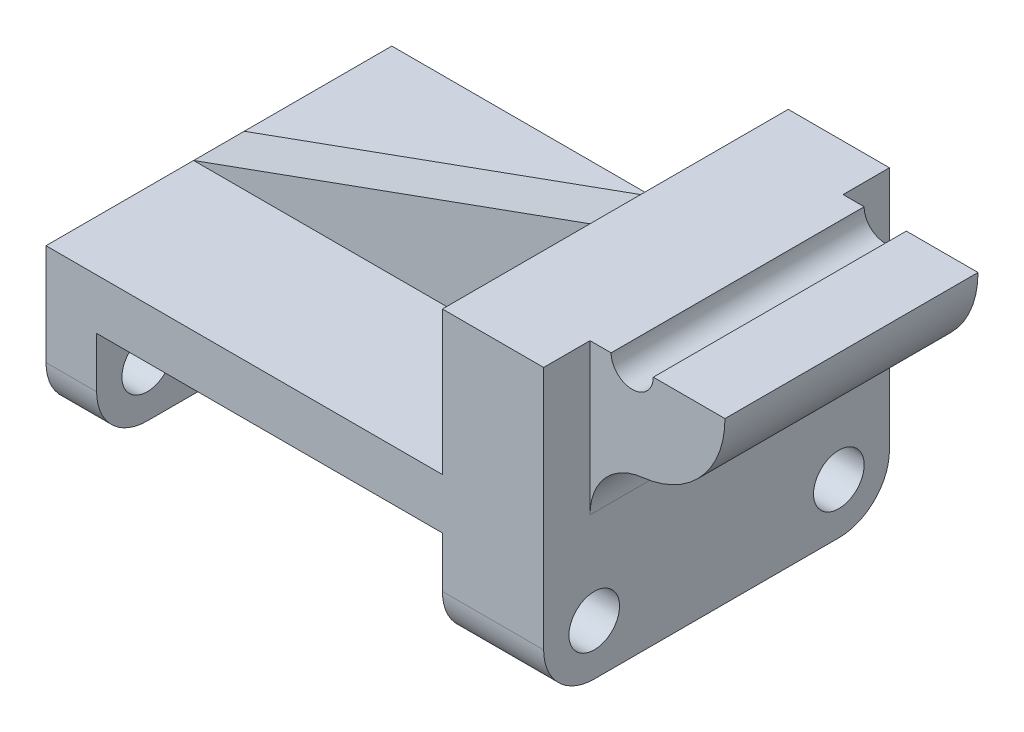
ISO-10303-21;
HEADER;
FILE_DESCRIPTION(('STEP AP214'),'2;1');
FILE_NAME('part.step','',(''),(''),'','','');
FILE_SCHEMA(('AUTOMOTIVE_DESIGN { 1 0 10303 214 1 1 1 1 }'));
ENDSEC;
DATA;
#1=APPLICATION_CONTEXT('core data for automotive mechanical design processes');
#2=APPLICATION_PROTOCOL_DEFINITION('international standard','automotive_design',2000,#1);
#3=PRODUCT_CONTEXT('',#1,'mechanical');
#4=PRODUCT('Part','Part','',(#3));
#5=PRODUCT_RELATED_PRODUCT_CATEGORY('part','',(#4));
#6=PRODUCT_DEFINITION_FORMATION('','',#4);
#7=PRODUCT_DEFINITION_CONTEXT('part definition',#1,'design');
#8=PRODUCT_DEFINITION('design','',#6,#7);
#9=PRODUCT_DEFINITION_SHAPE('','',#8);
#10=(LENGTH_UNIT() NAMED_UNIT(*) SI_UNIT(.MILLI.,.METRE.));
#11=(NAMED_UNIT(*) PLANE_ANGLE_UNIT() SI_UNIT($,.RADIAN.));
#12=(NAMED_UNIT(*) SI_UNIT($,.STERADIAN.) SOLID_ANGLE_UNIT());
#13=UNCERTAINTY_MEASURE_WITH_UNIT(LENGTH_MEASURE(1.E-05),#10,'distance_accuracy_value','');
#14=(GEOMETRIC_REPRESENTATION_CONTEXT(3) GLOBAL_UNCERTAINTY_ASSIGNED_CONTEXT((#13)) GLOBAL_UNIT_ASSIGNED_CONTEXT((#10,
#11,#12)) REPRESENTATION_CONTEXT('',''));
#15=CARTESIAN_POINT('',(0.,0.,0.));
#16=DIRECTION('',(0.,0.,1.));
#17=DIRECTION('',(1.,0.,0.));
#18=AXIS2_PLACEMENT_3D('',#15,#16,#17);
#19=CARTESIAN_POINT('',(0.,36.,-41.));
#20=DIRECTION('',(0.,1.,0.));
#21=DIRECTION('',(0.,0.,1.));
#22=AXIS2_PLACEMENT_3D('',#19,#20,#21);
#23=PLANE('',#22);
#24=DIRECTION('',(0.,0.,1.));
#25=VECTOR('',#24,1.);
#26=CARTESIAN_POINT('',(0.,36.,-41.));
#27=LINE('',#26,#25);
#28=CARTESIAN_POINT('',(0.,36.,-41.));
#29=VERTEX_POINT('',#28);
#30=CARTESIAN_POINT('',(0.,36.,-6.));
#31=VERTEX_POINT('',#30);
#32=EDGE_CURVE('E398',#29,#31,#27,.T.);
#33=ORIENTED_EDGE('',*,*,#32,.T.);
#34=DIRECTION('',(1.,0.,0.));
#35=VECTOR('',#34,1.);
#36=CARTESIAN_POINT('',(94.,36.,-6.));
#37=LINE('',#36,#35);
#38=CARTESIAN_POINT('',(94.,36.,-6.));
#39=VERTEX_POINT('',#38);
#40=EDGE_CURVE('E235',#31,#39,#37,.T.);
#41=ORIENTED_EDGE('',*,*,#40,.T.);
#42=DIRECTION('',(0.,0.,1.));
#43=VECTOR('',#42,1.);
#44=CARTESIAN_POINT('',(94.,36.,-41.));
#45=LINE('',#44,#43);
#46=CARTESIAN_POINT('',(94.,36.,-41.));
#47=VERTEX_POINT('',#46);
#48=EDGE_CURVE('E402',#47,#39,#45,.T.);
#49=ORIENTED_EDGE('',*,*,#48,.F.);
#50=DIRECTION('',(-1.,0.,0.));
#51=VECTOR('',#50,1.);
#52=CARTESIAN_POINT('',(0.,36.,-41.));
#53=LINE('',#52,#51);
#54=EDGE_CURVE('E384',#47,#29,#53,.T.);
#55=ORIENTED_EDGE('',*,*,#54,.T.);
#56=EDGE_LOOP('',(#33,#41,#49,#55));
#57=FACE_BOUND('',#56,.T.);
#58=ADVANCED_FACE('F45',(#57),#23,.T.);
#59=CARTESIAN_POINT('',(94.,36.,-41.));
#60=DIRECTION('',(-1.,0.,0.));
#61=DIRECTION('',(0.,0.,1.));
#62=AXIS2_PLACEMENT_3D('',#59,#60,#61);
#63=PLANE('',#62);
#64=ORIENTED_EDGE('',*,*,#48,.T.);
#65=DIRECTION('',(0.,1.,0.));
#66=VECTOR('',#65,1.);
#67=CARTESIAN_POINT('',(94.,70.,-6.));
#68=LINE('',#67,#66);
#69=CARTESIAN_POINT('',(94.,70.,-6.));
#70=VERTEX_POINT('',#69);
#71=EDGE_CURVE('E238',#39,#70,#68,.T.);
#72=ORIENTED_EDGE('',*,*,#71,.T.);
#73=DIRECTION('',(0.,0.,1.));
#74=VECTOR('',#73,1.);
#75=CARTESIAN_POINT('',(94.,70.,-41.));
#76=LINE('',#75,#74);
#77=CARTESIAN_POINT('',(94.,70.,-41.));
#78=VERTEX_POINT('',#77);
#79=EDGE_CURVE('E209',#78,#70,#76,.T.);
#80=ORIENTED_EDGE('',*,*,#79,.F.);
#81=DIRECTION('',(0.,-1.,0.));
#82=VECTOR('',#81,1.);
#83=CARTESIAN_POINT('',(94.,36.,-41.));
#84=LINE('',#83,#82);
#85=EDGE_CURVE('E380',#78,#47,#84,.T.);
#86=ORIENTED_EDGE('',*,*,#85,.T.);
#87=EDGE_LOOP('',(#64,#72,#80,#86));
#88=FACE_BOUND('',#87,.T.);
#89=ADVANCED_FACE('F575',(#88),#63,.T.);
#90=CARTESIAN_POINT('',(94.,70.,-41.));
#91=DIRECTION('',(0.,1.,0.));
#92=DIRECTION('',(0.,0.,1.));
#93=AXIS2_PLACEMENT_3D('',#90,#91,#92);
#94=PLANE('',#93);
#95=DIRECTION('',(0.,0.,1.));
#96=VECTOR('',#95,1.);
#97=CARTESIAN_POINT('',(123.,70.,-41.));
#98=LINE('',#97,#96);
#99=CARTESIAN_POINT('',(123.,70.,-30.));
#100=VERTEX_POINT('',#99);
#101=CARTESIAN_POINT('',(123.,70.,30.));
#102=VERTEX_POINT('',#101);
#103=EDGE_CURVE('E255',#100,#102,#98,.T.);
#104=ORIENTED_EDGE('',*,*,#103,.F.);
#105=DIRECTION('',(1.,0.,0.));
#106=VECTOR('',#105,1.);
#107=CARTESIAN_POINT('',(118.,70.,-30.));
#108=LINE('',#107,#106);
#109=CARTESIAN_POINT('',(118.,70.,-30.));
#110=VERTEX_POINT('',#109);
#111=EDGE_CURVE('E279',#110,#100,#108,.T.);
#112=ORIENTED_EDGE('',*,*,#111,.F.);
#113=DIRECTION('',(0.,0.,1.));
#114=VECTOR('',#113,1.);
#115=CARTESIAN_POINT('',(118.,70.,-41.));
#116=LINE('',#115,#114);
#117=CARTESIAN_POINT('',(118.,70.,-41.));
#118=VERTEX_POINT('',#117);
#119=EDGE_CURVE('E225',#118,#110,#116,.T.);
#120=ORIENTED_EDGE('',*,*,#119,.F.);
#121=DIRECTION('',(-1.,0.,0.));
#122=VECTOR('',#121,1.);
#123=CARTESIAN_POINT('',(94.,70.,-41.));
#124=LINE('',#123,#122);
#125=EDGE_CURVE('E377',#118,#78,#124,.T.);
#126=ORIENTED_EDGE('',*,*,#125,.T.);
#127=ORIENTED_EDGE('',*,*,#79,.T.);
#128=DIRECTION('',(0.,0.,1.));
#129=VECTOR('',#128,1.);
#130=CARTESIAN_POINT('',(94.,70.,-6.));
#131=LINE('',#130,#129);
#132=CARTESIAN_POINT('',(94.,70.,6.));
#133=VERTEX_POINT('',#132);
#134=EDGE_CURVE('E201',#70,#133,#131,.T.);
#135=ORIENTED_EDGE('',*,*,#134,.T.);
#136=CARTESIAN_POINT('',(94.,70.,41.));
#137=VERTEX_POINT('',#136);
#138=EDGE_CURVE('E206',#133,#137,#76,.T.);
#139=ORIENTED_EDGE('',*,*,#138,.T.);
#140=DIRECTION('',(-1.,0.,0.));
#141=VECTOR('',#140,1.);
#142=CARTESIAN_POINT('',(94.,70.,41.));
#143=LINE('',#142,#141);
#144=CARTESIAN_POINT('',(118.,70.,41.));
#145=VERTEX_POINT('',#144);
#146=EDGE_CURVE('E350',#145,#137,#143,.T.);
#147=ORIENTED_EDGE('',*,*,#146,.F.);
#148=CARTESIAN_POINT('',(118.,70.,30.));
#149=VERTEX_POINT('',#148);
#150=EDGE_CURVE('E410',#149,#145,#116,.T.);
#151=ORIENTED_EDGE('',*,*,#150,.F.);
#152=DIRECTION('',(1.,0.,0.));
#153=VECTOR('',#152,1.);
#154=CARTESIAN_POINT('',(118.,70.,30.));
#155=LINE('',#154,#153);
#156=EDGE_CURVE('E262',#149,#102,#155,.T.);
#157=ORIENTED_EDGE('',*,*,#156,.T.);
#158=EDGE_LOOP('',(#104,#112,#120,#126,#127,#135,#139,#147,#151,#157));
#159=FACE_BOUND('',#158,.T.);
#160=ADVANCED_FACE('F204',(#159),#94,.T.);
#161=CARTESIAN_POINT('',(118.,70.,-41.));
#162=DIRECTION('',(1.,0.,0.));
#163=DIRECTION('',(0.,1.,0.));
#164=AXIS2_PLACEMENT_3D('',#161,#162,#163);
#165=PLANE('',#164);
#166=CARTESIAN_POINT('',(118.,12.,-29.));
#167=DIRECTION('',(-1.,0.,0.));
#168=DIRECTION('',(0.,0.,1.));
#169=AXIS2_PLACEMENT_3D('',#166,#167,#168);
#170=CIRCLE('',#169,5.99999999999997);
#171=CARTESIAN_POINT('',(118.,12.,-23.));
#172=VERTEX_POINT('',#171);
#173=EDGE_CURVE('E309',#172,#172,#170,.T.);
#174=ORIENTED_EDGE('',*,*,#173,.T.);
#175=EDGE_LOOP('',(#174));
#176=FACE_BOUND('',#175,.T.);
#177=CARTESIAN_POINT('',(118.,12.,29.));
#178=DIRECTION('',(-1.,0.,0.));
#179=DIRECTION('',(0.,0.,1.));
#180=AXIS2_PLACEMENT_3D('',#177,#178,#179);
#181=CIRCLE('',#180,5.99999999999997);
#182=CARTESIAN_POINT('',(118.,12.,35.));
#183=VERTEX_POINT('',#182);
#184=EDGE_CURVE('E326',#183,#183,#181,.T.);
#185=ORIENTED_EDGE('',*,*,#184,.T.);
#186=EDGE_LOOP('',(#185));
#187=FACE_BOUND('',#186,.T.);
#188=ORIENTED_EDGE('',*,*,#119,.T.);
#189=DIRECTION('',(0.,1.,0.));
#190=VECTOR('',#189,1.);
#191=CARTESIAN_POINT('',(118.,34.2229123600034,-30.));
#192=LINE('',#191,#190);
#193=CARTESIAN_POINT('',(118.,34.2229123600034,-30.));
#194=VERTEX_POINT('',#193);
#195=EDGE_CURVE('E274',#194,#110,#192,.T.);
#196=ORIENTED_EDGE('',*,*,#195,.F.);
#197=DIRECTION('',(0.,0.,1.));
#198=VECTOR('',#197,1.);
#199=CARTESIAN_POINT('',(118.,34.2229123600034,-30.));
#200=LINE('',#199,#198);
#201=CARTESIAN_POINT('',(118.,34.2229123600034,30.));
#202=VERTEX_POINT('',#201);
#203=EDGE_CURVE('E291',#194,#202,#200,.T.);
#204=ORIENTED_EDGE('',*,*,#203,.T.);
#205=DIRECTION('',(0.,1.,0.));
#206=VECTOR('',#205,1.);
#207=CARTESIAN_POINT('',(118.,34.2229123600034,30.));
#208=LINE('',#207,#206);
#209=EDGE_CURVE('E258',#202,#149,#208,.T.);
#210=ORIENTED_EDGE('',*,*,#209,.T.);
#211=ORIENTED_EDGE('',*,*,#150,.T.);
#212=DIRECTION('',(0.,1.,0.));
#213=VECTOR('',#212,1.);
#214=CARTESIAN_POINT('',(118.,70.,41.));
#215=LINE('',#214,#213);
#216=CARTESIAN_POINT('',(118.,12.,41.));
#217=VERTEX_POINT('',#216);
#218=EDGE_CURVE('E346',#217,#145,#215,.T.);
#219=ORIENTED_EDGE('',*,*,#218,.F.);
#220=CARTESIAN_POINT('',(118.,12.,29.));
#221=DIRECTION('',(1.,0.,0.));
#222=DIRECTION('',(0.,1.,0.));
#223=AXIS2_PLACEMENT_3D('',#220,#221,#222);
#224=CIRCLE('',#223,12.);
#225=CARTESIAN_POINT('',(118.,0.,29.));
#226=VERTEX_POINT('',#225);
#227=EDGE_CURVE('E435',#217,#226,#224,.T.);
#228=ORIENTED_EDGE('',*,*,#227,.T.);
#229=DIRECTION('',(0.,0.,1.));
#230=VECTOR('',#229,1.);
#231=CARTESIAN_POINT('',(118.,0.,-41.));
#232=LINE('',#231,#230);
#233=CARTESIAN_POINT('',(118.,0.,-29.));
#234=VERTEX_POINT('',#233);
#235=EDGE_CURVE('E411',#234,#226,#232,.T.);
#236=ORIENTED_EDGE('',*,*,#235,.F.);
#237=CARTESIAN_POINT('',(118.,12.,-29.));
#238=DIRECTION('',(1.,0.,0.));
#239=DIRECTION('',(0.,1.,0.));
#240=AXIS2_PLACEMENT_3D('',#237,#238,#239);
#241=CIRCLE('',#240,12.);
#242=CARTESIAN_POINT('',(118.,12.,-41.));
#243=VERTEX_POINT('',#242);
#244=EDGE_CURVE('E438',#234,#243,#241,.T.);
#245=ORIENTED_EDGE('',*,*,#244,.T.);
#246=DIRECTION('',(0.,1.,0.));
#247=VECTOR('',#246,1.);
#248=CARTESIAN_POINT('',(118.,70.,-41.));
#249=LINE('',#248,#247);
#250=EDGE_CURVE('E374',#243,#118,#249,.T.);
#251=ORIENTED_EDGE('',*,*,#250,.T.);
#252=EDGE_LOOP('',(#188,#196,#204,#210,#211,#219,#228,#236,#245,#251));
#253=FACE_BOUND('',#252,.T.);
#254=ADVANCED_FACE('F510',(#176,#187,#253),#165,.T.);
#255=CARTESIAN_POINT('',(12.,0.,-41.));
#256=DIRECTION('',(0.,-1.,0.));
#257=DIRECTION('',(1.,0.,0.));
#258=AXIS2_PLACEMENT_3D('',#255,#256,#257);
#259=PLANE('',#258);
#260=DIRECTION('',(0.,0.,1.));
#261=VECTOR('',#260,1.);
#262=CARTESIAN_POINT('',(12.,0.,-41.));
#263=LINE('',#262,#261);
#264=CARTESIAN_POINT('',(12.,0.,-29.));
#265=VERTEX_POINT('',#264);
#266=CARTESIAN_POINT('',(12.,0.,29.));
#267=VERTEX_POINT('',#266);
#268=EDGE_CURVE('E392',#265,#267,#263,.T.);
#269=ORIENTED_EDGE('',*,*,#268,.T.);
#270=DIRECTION('',(1.,0.,0.));
#271=VECTOR('',#270,1.);
#272=CARTESIAN_POINT('',(0.,0.,29.));
#273=LINE('',#272,#271);
#274=CARTESIAN_POINT('',(0.,0.,29.));
#275=VERTEX_POINT('',#274);
#276=EDGE_CURVE('E471',#267,#275,#273,.F.);
#277=ORIENTED_EDGE('',*,*,#276,.T.);
#278=DIRECTION('',(0.,0.,1.));
#279=VECTOR('',#278,1.);
#280=CARTESIAN_POINT('',(0.,0.,-41.));
#281=LINE('',#280,#279);
#282=CARTESIAN_POINT('',(0.,0.,-29.));
#283=VERTEX_POINT('',#282);
#284=EDGE_CURVE('E393',#283,#275,#281,.T.);
#285=ORIENTED_EDGE('',*,*,#284,.F.);
#286=DIRECTION('',(1.,0.,0.));
#287=VECTOR('',#286,1.);
#288=CARTESIAN_POINT('',(12.,0.,-29.));
#289=LINE('',#288,#287);
#290=EDGE_CURVE('E467',#283,#265,#289,.T.);
#291=ORIENTED_EDGE('',*,*,#290,.T.);
#292=EDGE_LOOP('',(#269,#277,#285,#291));
#293=FACE_BOUND('',#292,.T.);
#294=ADVANCED_FACE('F535',(#293),#259,.T.);
#295=CARTESIAN_POINT('',(0.,0.,-41.));
#296=DIRECTION('',(-1.,0.,0.));
#297=DIRECTION('',(0.,0.,1.));
#298=AXIS2_PLACEMENT_3D('',#295,#296,#297);
#299=PLANE('',#298);
#300=CARTESIAN_POINT('',(0.,12.,-29.));
#301=DIRECTION('',(-1.,0.,0.));
#302=DIRECTION('',(0.,0.,1.));
#303=AXIS2_PLACEMENT_3D('',#300,#301,#302);
#304=CIRCLE('',#303,6.025);
#305=CARTESIAN_POINT('',(0.,12.,-22.975));
#306=VERTEX_POINT('',#305);
#307=EDGE_CURVE('E301',#306,#306,#304,.T.);
#308=ORIENTED_EDGE('',*,*,#307,.F.);
#309=EDGE_LOOP('',(#308));
#310=FACE_BOUND('',#309,.T.);
#311=CARTESIAN_POINT('',(0.,12.,29.));
#312=DIRECTION('',(-1.,0.,0.));
#313=DIRECTION('',(0.,0.,1.));
#314=AXIS2_PLACEMENT_3D('',#311,#312,#313);
#315=CIRCLE('',#314,6.025);
#316=CARTESIAN_POINT('',(0.,12.,35.025));
#317=VERTEX_POINT('',#316);
#318=EDGE_CURVE('E318',#317,#317,#315,.T.);
#319=ORIENTED_EDGE('',*,*,#318,.F.);
#320=EDGE_LOOP('',(#319));
#321=FACE_BOUND('',#320,.T.);
#322=ORIENTED_EDGE('',*,*,#284,.T.);
#323=CARTESIAN_POINT('',(0.,12.,29.));
#324=DIRECTION('',(-1.,0.,0.));
#325=DIRECTION('',(0.,0.,1.));
#326=AXIS2_PLACEMENT_3D('',#323,#324,#325);
#327=CIRCLE('',#326,12.);
#328=CARTESIAN_POINT('',(0.,12.,41.));
#329=VERTEX_POINT('',#328);
#330=EDGE_CURVE('E54',#275,#329,#327,.T.);
#331=ORIENTED_EDGE('',*,*,#330,.T.);
#332=DIRECTION('',(0.,-1.,0.));
#333=VECTOR('',#332,1.);
#334=CARTESIAN_POINT('',(0.,0.,41.));
#335=LINE('',#334,#333);
#336=CARTESIAN_POINT('',(0.,36.,41.));
#337=VERTEX_POINT('',#336);
#338=EDGE_CURVE('E359',#337,#329,#335,.T.);
#339=ORIENTED_EDGE('',*,*,#338,.F.);
#340=CARTESIAN_POINT('',(0.,36.,6.));
#341=VERTEX_POINT('',#340);
#342=EDGE_CURVE('E401',#341,#337,#27,.T.);
#343=ORIENTED_EDGE('',*,*,#342,.F.);
#344=DIRECTION('',(0.,0.,1.));
#345=VECTOR('',#344,1.);
#346=CARTESIAN_POINT('',(0.,36.,-6.));
#347=LINE('',#346,#345);
#348=EDGE_CURVE('E68',#31,#341,#347,.T.);
#349=ORIENTED_EDGE('',*,*,#348,.F.);
#350=ORIENTED_EDGE('',*,*,#32,.F.);
#351=DIRECTION('',(0.,-1.,0.));
#352=VECTOR('',#351,1.);
#353=CARTESIAN_POINT('',(0.,0.,-41.));
#354=LINE('',#353,#352);
#355=CARTESIAN_POINT('',(0.,12.,-41.));
#356=VERTEX_POINT('',#355);
#357=EDGE_CURVE('E388',#29,#356,#354,.T.);
#358=ORIENTED_EDGE('',*,*,#357,.T.);
#359=CARTESIAN_POINT('',(0.,12.,-29.));
#360=DIRECTION('',(-1.,0.,0.));
#361=DIRECTION('',(0.,0.,1.));
#362=AXIS2_PLACEMENT_3D('',#359,#360,#361);
#363=CIRCLE('',#362,12.);
#364=EDGE_CURVE('E474',#356,#283,#363,.T.);
#365=ORIENTED_EDGE('',*,*,#364,.T.);
#366=EDGE_LOOP('',(#322,#331,#339,#343,#349,#350,#358,#365));
#367=FACE_BOUND('',#366,.T.);
#368=ADVANCED_FACE('F532',(#310,#321,#367),#299,.T.);
#369=DIRECTION('',(1.,0.,0.));
#370=VECTOR('',#369,1.);
#371=CARTESIAN_POINT('',(94.,36.,6.));
#372=LINE('',#371,#370);
#373=CARTESIAN_POINT('',(94.,36.,6.));
#374=VERTEX_POINT('',#373);
#375=EDGE_CURVE('E61',#341,#374,#372,.T.);
#376=ORIENTED_EDGE('',*,*,#375,.F.);
#377=ORIENTED_EDGE('',*,*,#342,.T.);
#378=DIRECTION('',(-1.,0.,0.));
#379=VECTOR('',#378,1.);
#380=CARTESIAN_POINT('',(0.,36.,41.));
#381=LINE('',#380,#379);
#382=CARTESIAN_POINT('',(94.,36.,41.));
#383=VERTEX_POINT('',#382);
#384=EDGE_CURVE('E355',#383,#337,#381,.T.);
#385=ORIENTED_EDGE('',*,*,#384,.F.);
#386=EDGE_CURVE('E405',#374,#383,#45,.T.);
#387=ORIENTED_EDGE('',*,*,#386,.F.);
#388=EDGE_LOOP('',(#376,#377,#385,#387));
#389=FACE_BOUND('',#388,.T.);
#390=ADVANCED_FACE('F543',(#389),#23,.T.);
#391=DIRECTION('',(0.,1.,0.));
#392=VECTOR('',#391,1.);
#393=CARTESIAN_POINT('',(94.,70.,6.));
#394=LINE('',#393,#392);
#395=EDGE_CURVE('E221',#374,#133,#394,.T.);
#396=ORIENTED_EDGE('',*,*,#395,.F.);
#397=ORIENTED_EDGE('',*,*,#386,.T.);
#398=DIRECTION('',(0.,-1.,0.));
#399=VECTOR('',#398,1.);
#400=CARTESIAN_POINT('',(94.,36.,41.));
#401=LINE('',#400,#399);
#402=EDGE_CURVE('E223',#137,#383,#401,.T.);
#403=ORIENTED_EDGE('',*,*,#402,.F.);
#404=ORIENTED_EDGE('',*,*,#138,.F.);
#405=EDGE_LOOP('',(#396,#397,#403,#404));
#406=FACE_BOUND('',#405,.T.);
#407=ADVANCED_FACE('F220',(#406),#63,.T.);
#408=DIRECTION('',(0.,0.,1.));
#409=VECTOR('',#408,1.);
#410=CARTESIAN_POINT('',(133.,70.,-41.));
#411=LINE('',#410,#409);
#412=CARTESIAN_POINT('',(133.,70.,30.));
#413=VERTEX_POINT('',#412);
#414=CARTESIAN_POINT('',(133.,70.,-30.));
#415=VERTEX_POINT('',#414);
#416=EDGE_CURVE('E252',#413,#415,#411,.F.);
#417=ORIENTED_EDGE('',*,*,#416,.F.);
#418=CARTESIAN_POINT('',(150.,70.,30.));
#419=VERTEX_POINT('',#418);
#420=EDGE_CURVE('E261',#413,#419,#155,.T.);
#421=ORIENTED_EDGE('',*,*,#420,.T.);
#422=DIRECTION('',(0.,0.,1.));
#423=VECTOR('',#422,1.);
#424=CARTESIAN_POINT('',(150.,70.,-30.));
#425=LINE('',#424,#423);
#426=CARTESIAN_POINT('',(150.,70.,-30.));
#427=VERTEX_POINT('',#426);
#428=EDGE_CURVE('E297',#427,#419,#425,.T.);
#429=ORIENTED_EDGE('',*,*,#428,.F.);
#430=EDGE_CURVE('E278',#415,#427,#108,.T.);
#431=ORIENTED_EDGE('',*,*,#430,.F.);
#432=EDGE_LOOP('',(#417,#421,#429,#431));
#433=FACE_BOUND('',#432,.T.);
#434=ADVANCED_FACE('F560',(#433),#94,.T.);
#435=CARTESIAN_POINT('',(118.,0.,-41.));
#436=DIRECTION('',(0.,-1.,0.));
#437=DIRECTION('',(1.,0.,0.));
#438=AXIS2_PLACEMENT_3D('',#435,#436,#437);
#439=PLANE('',#438);
#440=DIRECTION('',(0.,0.,1.));
#441=VECTOR('',#440,1.);
#442=CARTESIAN_POINT('',(94.,0.,-41.));
#443=LINE('',#442,#441);
#444=CARTESIAN_POINT('',(94.,0.,-29.));
#445=VERTEX_POINT('',#444);
#446=CARTESIAN_POINT('',(94.,0.,29.));
#447=VERTEX_POINT('',#446);
#448=EDGE_CURVE('E415',#445,#447,#443,.T.);
#449=ORIENTED_EDGE('',*,*,#448,.F.);
#450=DIRECTION('',(1.,0.,0.));
#451=VECTOR('',#450,1.);
#452=CARTESIAN_POINT('',(118.,0.,-29.));
#453=LINE('',#452,#451);
#454=EDGE_CURVE('E431',#445,#234,#453,.T.);
#455=ORIENTED_EDGE('',*,*,#454,.T.);
#456=ORIENTED_EDGE('',*,*,#235,.T.);
#457=DIRECTION('',(1.,0.,0.));
#458=VECTOR('',#457,1.);
#459=CARTESIAN_POINT('',(94.,0.,29.));
#460=LINE('',#459,#458);
#461=EDGE_CURVE('E397',#226,#447,#460,.F.);
#462=ORIENTED_EDGE('',*,*,#461,.T.);
#463=EDGE_LOOP('',(#449,#455,#456,#462));
#464=FACE_BOUND('',#463,.T.);
#465=ADVANCED_FACE('F492',(#464),#439,.T.);
#466=CARTESIAN_POINT('',(94.,0.,-41.));
#467=DIRECTION('',(-1.,0.,0.));
#468=DIRECTION('',(0.,0.,1.));
#469=AXIS2_PLACEMENT_3D('',#466,#467,#468);
#470=PLANE('',#469);
#471=CARTESIAN_POINT('',(94.,12.,-29.));
#472=DIRECTION('',(-1.,0.,0.));
#473=DIRECTION('',(0.,0.,1.));
#474=AXIS2_PLACEMENT_3D('',#471,#472,#473);
#475=CIRCLE('',#474,5.99999999999998);
#476=CARTESIAN_POINT('',(94.,12.,-23.));
#477=VERTEX_POINT('',#476);
#478=EDGE_CURVE('E313',#477,#477,#475,.T.);
#479=ORIENTED_EDGE('',*,*,#478,.F.);
#480=EDGE_LOOP('',(#479));
#481=FACE_BOUND('',#480,.T.);
#482=CARTESIAN_POINT('',(94.,12.,29.));
#483=DIRECTION('',(-1.,0.,0.));
#484=DIRECTION('',(0.,0.,1.));
#485=AXIS2_PLACEMENT_3D('',#482,#483,#484);
#486=CIRCLE('',#485,5.99999999999998);
#487=CARTESIAN_POINT('',(94.,12.,35.));
#488=VERTEX_POINT('',#487);
#489=EDGE_CURVE('E330',#488,#488,#486,.T.);
#490=ORIENTED_EDGE('',*,*,#489,.F.);
#491=EDGE_LOOP('',(#490));
#492=FACE_BOUND('',#491,.T.);
#493=DIRECTION('',(0.,-1.,0.));
#494=VECTOR('',#493,1.);
#495=CARTESIAN_POINT('',(94.,0.,-41.));
#496=LINE('',#495,#494);
#497=CARTESIAN_POINT('',(94.,24.,-41.));
#498=VERTEX_POINT('',#497);
#499=CARTESIAN_POINT('',(94.,12.,-41.));
#500=VERTEX_POINT('',#499);
#501=EDGE_CURVE('E370',#498,#500,#496,.T.);
#502=ORIENTED_EDGE('',*,*,#501,.T.);
#503=CARTESIAN_POINT('',(94.,12.,-29.));
#504=DIRECTION('',(-1.,0.,0.));
#505=DIRECTION('',(0.,0.,1.));
#506=AXIS2_PLACEMENT_3D('',#503,#504,#505);
#507=CIRCLE('',#506,12.);
#508=EDGE_CURVE('E450',#500,#445,#507,.T.);
#509=ORIENTED_EDGE('',*,*,#508,.T.);
#510=ORIENTED_EDGE('',*,*,#448,.T.);
#511=CARTESIAN_POINT('',(94.,12.,29.));
#512=DIRECTION('',(-1.,0.,0.));
#513=DIRECTION('',(0.,0.,1.));
#514=AXIS2_PLACEMENT_3D('',#511,#512,#513);
#515=CIRCLE('',#514,12.);
#516=CARTESIAN_POINT('',(94.,12.,41.));
#517=VERTEX_POINT('',#516);
#518=EDGE_CURVE('E447',#447,#517,#515,.T.);
#519=ORIENTED_EDGE('',*,*,#518,.T.);
#520=DIRECTION('',(0.,-1.,0.));
#521=VECTOR('',#520,1.);
#522=CARTESIAN_POINT('',(94.,0.,41.));
#523=LINE('',#522,#521);
#524=CARTESIAN_POINT('',(94.,24.,41.));
#525=VERTEX_POINT('',#524);
#526=EDGE_CURVE('E342',#525,#517,#523,.T.);
#527=ORIENTED_EDGE('',*,*,#526,.F.);
#528=DIRECTION('',(0.,0.,1.));
#529=VECTOR('',#528,1.);
#530=CARTESIAN_POINT('',(94.,24.,-41.));
#531=LINE('',#530,#529);
#532=EDGE_CURVE('E419',#498,#525,#531,.T.);
#533=ORIENTED_EDGE('',*,*,#532,.F.);
#534=EDGE_LOOP('',(#502,#509,#510,#519,#527,#533));
#535=FACE_BOUND('',#534,.T.);
#536=ADVANCED_FACE('F488',(#481,#492,#535),#470,.T.);
#537=CARTESIAN_POINT('',(94.,24.,-41.));
#538=DIRECTION('',(0.,-1.,0.));
#539=DIRECTION('',(1.,0.,0.));
#540=AXIS2_PLACEMENT_3D('',#537,#538,#539);
#541=PLANE('',#540);
#542=ORIENTED_EDGE('',*,*,#532,.T.);
#543=DIRECTION('',(1.,0.,0.));
#544=VECTOR('',#543,1.);
#545=CARTESIAN_POINT('',(94.,24.,41.));
#546=LINE('',#545,#544);
#547=CARTESIAN_POINT('',(12.,24.,41.));
#548=VERTEX_POINT('',#547);
#549=EDGE_CURVE('E338',#548,#525,#546,.T.);
#550=ORIENTED_EDGE('',*,*,#549,.F.);
#551=DIRECTION('',(0.,0.,1.));
#552=VECTOR('',#551,1.);
#553=CARTESIAN_POINT('',(12.,24.,-41.));
#554=LINE('',#553,#552);
#555=CARTESIAN_POINT('',(12.,24.,-41.));
#556=VERTEX_POINT('',#555);
#557=EDGE_CURVE('E422',#556,#548,#554,.T.);
#558=ORIENTED_EDGE('',*,*,#557,.F.);
#559=DIRECTION('',(1.,0.,0.));
#560=VECTOR('',#559,1.);
#561=CARTESIAN_POINT('',(94.,24.,-41.));
#562=LINE('',#561,#560);
#563=EDGE_CURVE('E366',#556,#498,#562,.T.);
#564=ORIENTED_EDGE('',*,*,#563,.T.);
#565=EDGE_LOOP('',(#542,#550,#558,#564));
#566=FACE_BOUND('',#565,.T.);
#567=ADVANCED_FACE('F491',(#566),#541,.T.);
#568=CARTESIAN_POINT('',(12.,24.,-41.));
#569=DIRECTION('',(1.,0.,0.));
#570=DIRECTION('',(0.,1.,0.));
#571=AXIS2_PLACEMENT_3D('',#568,#569,#570);
#572=PLANE('',#571);
#573=CARTESIAN_POINT('',(12.,12.,-29.));
#574=DIRECTION('',(1.,0.,0.));
#575=DIRECTION('',(0.,1.,0.));
#576=AXIS2_PLACEMENT_3D('',#573,#574,#575);
#577=CIRCLE('',#576,5.99999999999998);
#578=CARTESIAN_POINT('',(12.,18.,-29.));
#579=VERTEX_POINT('',#578);
#580=EDGE_CURVE('E314',#579,#579,#577,.T.);
#581=ORIENTED_EDGE('',*,*,#580,.F.);
#582=EDGE_LOOP('',(#581));
#583=FACE_BOUND('',#582,.T.);
#584=CARTESIAN_POINT('',(12.,12.,29.));
#585=DIRECTION('',(1.,0.,0.));
#586=DIRECTION('',(0.,1.,0.));
#587=AXIS2_PLACEMENT_3D('',#584,#585,#586);
#588=CIRCLE('',#587,5.99999999999998);
#589=CARTESIAN_POINT('',(12.,18.,29.));
#590=VERTEX_POINT('',#589);
#591=EDGE_CURVE('E331',#590,#590,#588,.T.);
#592=ORIENTED_EDGE('',*,*,#591,.F.);
#593=EDGE_LOOP('',(#592));
#594=FACE_BOUND('',#593,.T.);
#595=DIRECTION('',(0.,1.,0.));
#596=VECTOR('',#595,1.);
#597=CARTESIAN_POINT('',(12.,24.,41.));
#598=LINE('',#597,#596);
#599=CARTESIAN_POINT('',(12.,12.,41.));
#600=VERTEX_POINT('',#599);
#601=EDGE_CURVE('E335',#600,#548,#598,.T.);
#602=ORIENTED_EDGE('',*,*,#601,.F.);
#603=CARTESIAN_POINT('',(12.,12.,29.));
#604=DIRECTION('',(1.,0.,0.));
#605=DIRECTION('',(0.,1.,0.));
#606=AXIS2_PLACEMENT_3D('',#603,#604,#605);
#607=CIRCLE('',#606,12.);
#608=EDGE_CURVE('E464',#600,#267,#607,.T.);
#609=ORIENTED_EDGE('',*,*,#608,.T.);
#610=ORIENTED_EDGE('',*,*,#268,.F.);
#611=CARTESIAN_POINT('',(12.,12.,-29.));
#612=DIRECTION('',(1.,0.,0.));
#613=DIRECTION('',(0.,1.,0.));
#614=AXIS2_PLACEMENT_3D('',#611,#612,#613);
#615=CIRCLE('',#614,12.);
#616=CARTESIAN_POINT('',(12.,12.,-41.));
#617=VERTEX_POINT('',#616);
#618=EDGE_CURVE('E461',#265,#617,#615,.T.);
#619=ORIENTED_EDGE('',*,*,#618,.T.);
#620=DIRECTION('',(0.,1.,0.));
#621=VECTOR('',#620,1.);
#622=CARTESIAN_POINT('',(12.,24.,-41.));
#623=LINE('',#622,#621);
#624=EDGE_CURVE('E363',#617,#556,#623,.T.);
#625=ORIENTED_EDGE('',*,*,#624,.T.);
#626=ORIENTED_EDGE('',*,*,#557,.T.);
#627=EDGE_LOOP('',(#602,#609,#610,#619,#625,#626));
#628=FACE_BOUND('',#627,.T.);
#629=ADVANCED_FACE('F605',(#583,#594,#628),#572,.T.);
#630=CARTESIAN_POINT('',(0.,0.,-41.));
#631=DIRECTION('',(0.,0.,-1.));
#632=DIRECTION('',(-1.,0.,0.));
#633=AXIS2_PLACEMENT_3D('',#630,#631,#632);
#634=PLANE('',#633);
#635=ORIENTED_EDGE('',*,*,#250,.F.);
#636=DIRECTION('',(1.,0.,0.));
#637=VECTOR('',#636,1.);
#638=CARTESIAN_POINT('',(0.,12.,-41.));
#639=LINE('',#638,#637);
#640=EDGE_CURVE('E444',#243,#500,#639,.F.);
#641=ORIENTED_EDGE('',*,*,#640,.T.);
#642=ORIENTED_EDGE('',*,*,#501,.F.);
#643=ORIENTED_EDGE('',*,*,#563,.F.);
#644=ORIENTED_EDGE('',*,*,#624,.F.);
#645=DIRECTION('',(1.,0.,0.));
#646=VECTOR('',#645,1.);
#647=CARTESIAN_POINT('',(0.,12.,-41.));
#648=LINE('',#647,#646);
#649=EDGE_CURVE('E441',#617,#356,#648,.F.);
#650=ORIENTED_EDGE('',*,*,#649,.T.);
#651=ORIENTED_EDGE('',*,*,#357,.F.);
#652=ORIENTED_EDGE('',*,*,#54,.F.);
#653=ORIENTED_EDGE('',*,*,#85,.F.);
#654=ORIENTED_EDGE('',*,*,#125,.F.);
#655=EDGE_LOOP('',(#635,#641,#642,#643,#644,#650,#651,#652,#653,#654));
#656=FACE_BOUND('',#655,.T.);
#657=ADVANCED_FACE('F524',(#656),#634,.T.);
#658=CARTESIAN_POINT('',(0.,0.,41.));
#659=DIRECTION('',(0.,0.,-1.));
#660=DIRECTION('',(-1.,0.,0.));
#661=AXIS2_PLACEMENT_3D('',#658,#659,#660);
#662=PLANE('',#661);
#663=ORIENTED_EDGE('',*,*,#526,.T.);
#664=DIRECTION('',(1.,0.,0.));
#665=VECTOR('',#664,1.);
#666=CARTESIAN_POINT('',(118.,12.,41.));
#667=LINE('',#666,#665);
#668=EDGE_CURVE('E457',#517,#217,#667,.T.);
#669=ORIENTED_EDGE('',*,*,#668,.T.);
#670=ORIENTED_EDGE('',*,*,#218,.T.);
#671=ORIENTED_EDGE('',*,*,#146,.T.);
#672=ORIENTED_EDGE('',*,*,#402,.T.);
#673=ORIENTED_EDGE('',*,*,#384,.T.);
#674=ORIENTED_EDGE('',*,*,#338,.T.);
#675=DIRECTION('',(1.,0.,0.));
#676=VECTOR('',#675,1.);
#677=CARTESIAN_POINT('',(12.,12.,41.));
#678=LINE('',#677,#676);
#679=EDGE_CURVE('E453',#329,#600,#678,.T.);
#680=ORIENTED_EDGE('',*,*,#679,.T.);
#681=ORIENTED_EDGE('',*,*,#601,.T.);
#682=ORIENTED_EDGE('',*,*,#549,.T.);
#683=EDGE_LOOP('',(#663,#669,#670,#671,#672,#673,#674,#680,#681,#682));
#684=FACE_BOUND('',#683,.T.);
#685=ADVANCED_FACE('F518',(#684),#662,.F.);
#686=CARTESIAN_POINT('',(118.,12.,-29.));
#687=DIRECTION('',(1.,0.,0.));
#688=DIRECTION('',(0.,1.,0.));
#689=AXIS2_PLACEMENT_3D('',#686,#687,#688);
#690=CYLINDRICAL_SURFACE('',#689,12.);
#691=ORIENTED_EDGE('',*,*,#508,.F.);
#692=ORIENTED_EDGE('',*,*,#640,.F.);
#693=ORIENTED_EDGE('',*,*,#244,.F.);
#694=ORIENTED_EDGE('',*,*,#454,.F.);
#695=EDGE_LOOP('',(#691,#692,#693,#694));
#696=FACE_BOUND('',#695,.T.);
#697=ADVANCED_FACE('F505',(#696),#690,.T.);
#698=CARTESIAN_POINT('',(0.,12.,29.));
#699=DIRECTION('',(-1.,0.,0.));
#700=DIRECTION('',(0.,-1.,0.));
#701=AXIS2_PLACEMENT_3D('',#698,#699,#700);
#702=CYLINDRICAL_SURFACE('',#701,12.);
#703=ORIENTED_EDGE('',*,*,#518,.F.);
#704=ORIENTED_EDGE('',*,*,#461,.F.);
#705=ORIENTED_EDGE('',*,*,#227,.F.);
#706=ORIENTED_EDGE('',*,*,#668,.F.);
#707=EDGE_LOOP('',(#703,#704,#705,#706));
#708=FACE_BOUND('',#707,.T.);
#709=ADVANCED_FACE('F516',(#708),#702,.T.);
#710=CARTESIAN_POINT('',(0.,12.,29.));
#711=DIRECTION('',(-1.,0.,0.));
#712=DIRECTION('',(0.,-1.,0.));
#713=AXIS2_PLACEMENT_3D('',#710,#711,#712);
#714=CYLINDRICAL_SURFACE('',#713,12.);
#715=ORIENTED_EDGE('',*,*,#330,.F.);
#716=ORIENTED_EDGE('',*,*,#276,.F.);
#717=ORIENTED_EDGE('',*,*,#608,.F.);
#718=ORIENTED_EDGE('',*,*,#679,.F.);
#719=EDGE_LOOP('',(#715,#716,#717,#718));
#720=FACE_BOUND('',#719,.T.);
#721=ADVANCED_FACE('F539',(#720),#714,.T.);
#722=CARTESIAN_POINT('',(12.,12.,-29.));
#723=DIRECTION('',(1.,0.,0.));
#724=DIRECTION('',(0.,1.,0.));
#725=AXIS2_PLACEMENT_3D('',#722,#723,#724);
#726=CYLINDRICAL_SURFACE('',#725,12.);
#727=ORIENTED_EDGE('',*,*,#364,.F.);
#728=ORIENTED_EDGE('',*,*,#649,.F.);
#729=ORIENTED_EDGE('',*,*,#618,.F.);
#730=ORIENTED_EDGE('',*,*,#290,.F.);
#731=EDGE_LOOP('',(#727,#728,#729,#730));
#732=FACE_BOUND('',#731,.T.);
#733=ADVANCED_FACE('F47',(#732),#726,.T.);
#734=CARTESIAN_POINT('',(0.,12.,29.));
#735=DIRECTION('',(-1.,0.,0.));
#736=DIRECTION('',(0.,0.,1.));
#737=AXIS2_PLACEMENT_3D('',#734,#735,#736);
#738=CONICAL_SURFACE('',#737,6.025,0.785398163397743);
#739=CARTESIAN_POINT('',(0.0249999999999972,12.,29.));
#740=DIRECTION('',(-1.,0.,0.));
#741=DIRECTION('',(0.,0.,1.));
#742=AXIS2_PLACEMENT_3D('',#739,#740,#741);
#743=CIRCLE('',#742,5.99999999999999);
#744=CARTESIAN_POINT('',(0.0249999999999972,12.,35.));
#745=VERTEX_POINT('',#744);
#746=EDGE_CURVE('E322',#745,#745,#743,.T.);
#747=ORIENTED_EDGE('',*,*,#746,.F.);
#748=EDGE_LOOP('',(#747));
#749=FACE_BOUND('',#748,.T.);
#750=ORIENTED_EDGE('',*,*,#318,.T.);
#751=EDGE_LOOP('',(#750));
#752=FACE_BOUND('',#751,.T.);
#753=ADVANCED_FACE('F613',(#749,#752),#738,.F.);
#754=CARTESIAN_POINT('',(0.,12.,29.));
#755=DIRECTION('',(-1.,0.,0.));
#756=DIRECTION('',(0.,0.,1.));
#757=AXIS2_PLACEMENT_3D('',#754,#755,#756);
#758=CYLINDRICAL_SURFACE('',#757,5.99999999999998);
#759=ORIENTED_EDGE('',*,*,#591,.T.);
#760=EDGE_LOOP('',(#759));
#761=FACE_BOUND('',#760,.T.);
#762=ORIENTED_EDGE('',*,*,#746,.T.);
#763=EDGE_LOOP('',(#762));
#764=FACE_BOUND('',#763,.T.);
#765=ADVANCED_FACE('F611',(#761,#764),#758,.F.);
#766=ORIENTED_EDGE('',*,*,#489,.T.);
#767=EDGE_LOOP('',(#766));
#768=FACE_BOUND('',#767,.T.);
#769=ORIENTED_EDGE('',*,*,#184,.F.);
#770=EDGE_LOOP('',(#769));
#771=FACE_BOUND('',#770,.T.);
#772=ADVANCED_FACE('F608',(#768,#771),#758,.F.);
#773=CARTESIAN_POINT('',(0.,12.,-29.));
#774=DIRECTION('',(-1.,0.,0.));
#775=DIRECTION('',(0.,0.,1.));
#776=AXIS2_PLACEMENT_3D('',#773,#774,#775);
#777=CYLINDRICAL_SURFACE('',#776,5.99999999999998);
#778=ORIENTED_EDGE('',*,*,#478,.T.);
#779=EDGE_LOOP('',(#778));
#780=FACE_BOUND('',#779,.T.);
#781=ORIENTED_EDGE('',*,*,#173,.F.);
#782=EDGE_LOOP('',(#781));
#783=FACE_BOUND('',#782,.T.);
#784=ADVANCED_FACE('F485',(#780,#783),#777,.F.);
#785=ORIENTED_EDGE('',*,*,#580,.T.);
#786=EDGE_LOOP('',(#785));
#787=FACE_BOUND('',#786,.T.);
#788=CARTESIAN_POINT('',(0.0249999999999972,12.,-29.));
#789=DIRECTION('',(-1.,0.,0.));
#790=DIRECTION('',(0.,0.,1.));
#791=AXIS2_PLACEMENT_3D('',#788,#789,#790);
#792=CIRCLE('',#791,5.99999999999999);
#793=CARTESIAN_POINT('',(0.0249999999999972,12.,-23.));
#794=VERTEX_POINT('',#793);
#795=EDGE_CURVE('E305',#794,#794,#792,.T.);
#796=ORIENTED_EDGE('',*,*,#795,.T.);
#797=EDGE_LOOP('',(#796));
#798=FACE_BOUND('',#797,.T.);
#799=ADVANCED_FACE('F619',(#787,#798),#777,.F.);
#800=CARTESIAN_POINT('',(0.,12.,-29.));
#801=DIRECTION('',(-1.,0.,0.));
#802=DIRECTION('',(0.,0.,1.));
#803=AXIS2_PLACEMENT_3D('',#800,#801,#802);
#804=CONICAL_SURFACE('',#803,6.025,0.785398163397743);
#805=ORIENTED_EDGE('',*,*,#795,.F.);
#806=EDGE_LOOP('',(#805));
#807=FACE_BOUND('',#806,.T.);
#808=ORIENTED_EDGE('',*,*,#307,.T.);
#809=EDGE_LOOP('',(#808));
#810=FACE_BOUND('',#809,.T.);
#811=ADVANCED_FACE('F620',(#807,#810),#804,.F.);
#812=CARTESIAN_POINT('',(128.,70.,-30.));
#813=DIRECTION('',(0.,0.,1.));
#814=DIRECTION('',(1.,0.,0.));
#815=AXIS2_PLACEMENT_3D('',#812,#813,#814);
#816=CYLINDRICAL_SURFACE('',#815,22.);
#817=ORIENTED_EDGE('',*,*,#428,.T.);
#818=CARTESIAN_POINT('',(128.,70.,30.));
#819=DIRECTION('',(0.,0.,1.));
#820=DIRECTION('',(1.,0.,0.));
#821=AXIS2_PLACEMENT_3D('',#818,#819,#820);
#822=CIRCLE('',#821,22.);
#823=CARTESIAN_POINT('',(130.444444444444,48.1362242200021,30.));
#824=VERTEX_POINT('',#823);
#825=EDGE_CURVE('E266',#824,#419,#822,.T.);
#826=ORIENTED_EDGE('',*,*,#825,.F.);
#827=DIRECTION('',(0.,0.,1.));
#828=VECTOR('',#827,1.);
#829=CARTESIAN_POINT('',(130.444444444444,48.1362242200021,-30.));
#830=LINE('',#829,#828);
#831=CARTESIAN_POINT('',(130.444444444444,48.1362242200021,-30.));
#832=VERTEX_POINT('',#831);
#833=EDGE_CURVE('E294',#832,#824,#830,.T.);
#834=ORIENTED_EDGE('',*,*,#833,.F.);
#835=CARTESIAN_POINT('',(128.,70.,-30.));
#836=DIRECTION('',(0.,0.,1.));
#837=DIRECTION('',(1.,0.,0.));
#838=AXIS2_PLACEMENT_3D('',#835,#836,#837);
#839=CIRCLE('',#838,22.);
#840=EDGE_CURVE('E283',#832,#427,#839,.T.);
#841=ORIENTED_EDGE('',*,*,#840,.T.);
#842=EDGE_LOOP('',(#817,#826,#834,#841));
#843=FACE_BOUND('',#842,.T.);
#844=ADVANCED_FACE('F623',(#843),#816,.T.);
#845=CARTESIAN_POINT('',(132.,34.2229123600034,-30.));
#846=DIRECTION('',(0.,0.,1.));
#847=DIRECTION('',(1.,0.,0.));
#848=AXIS2_PLACEMENT_3D('',#845,#846,#847);
#849=CYLINDRICAL_SURFACE('',#848,14.);
#850=ORIENTED_EDGE('',*,*,#833,.T.);
#851=CARTESIAN_POINT('',(132.,34.2229123600034,30.));
#852=DIRECTION('',(0.,0.,1.));
#853=DIRECTION('',(1.,0.,0.));
#854=AXIS2_PLACEMENT_3D('',#851,#852,#853);
#855=CIRCLE('',#854,14.);
#856=EDGE_CURVE('E270',#824,#202,#855,.T.);
#857=ORIENTED_EDGE('',*,*,#856,.T.);
#858=ORIENTED_EDGE('',*,*,#203,.F.);
#859=CARTESIAN_POINT('',(132.,34.2229123600034,-30.));
#860=DIRECTION('',(0.,0.,1.));
#861=DIRECTION('',(1.,0.,0.));
#862=AXIS2_PLACEMENT_3D('',#859,#860,#861);
#863=CIRCLE('',#862,14.);
#864=EDGE_CURVE('E287',#832,#194,#863,.T.);
#865=ORIENTED_EDGE('',*,*,#864,.F.);
#866=EDGE_LOOP('',(#850,#857,#858,#865));
#867=FACE_BOUND('',#866,.T.);
#868=ADVANCED_FACE('F627',(#867),#849,.F.);
#869=CARTESIAN_POINT('',(128.,70.,-30.));
#870=DIRECTION('',(0.,0.,1.));
#871=DIRECTION('',(1.,0.,0.));
#872=AXIS2_PLACEMENT_3D('',#869,#870,#871);
#873=PLANE('',#872);
#874=ORIENTED_EDGE('',*,*,#111,.T.);
#875=CARTESIAN_POINT('',(128.,70.,-30.));
#876=DIRECTION('',(0.,0.,1.));
#877=DIRECTION('',(1.,0.,0.));
#878=AXIS2_PLACEMENT_3D('',#875,#876,#877);
#879=CIRCLE('',#878,5.00000000000002);
#880=EDGE_CURVE('E247',#100,#415,#879,.T.);
#881=ORIENTED_EDGE('',*,*,#880,.T.);
#882=ORIENTED_EDGE('',*,*,#430,.T.);
#883=ORIENTED_EDGE('',*,*,#840,.F.);
#884=ORIENTED_EDGE('',*,*,#864,.T.);
#885=ORIENTED_EDGE('',*,*,#195,.T.);
#886=EDGE_LOOP('',(#874,#881,#882,#883,#884,#885));
#887=FACE_BOUND('',#886,.T.);
#888=ADVANCED_FACE('F566',(#887),#873,.F.);
#889=CARTESIAN_POINT('',(128.,70.,30.));
#890=DIRECTION('',(0.,0.,1.));
#891=DIRECTION('',(1.,0.,0.));
#892=AXIS2_PLACEMENT_3D('',#889,#890,#891);
#893=PLANE('',#892);
#894=CARTESIAN_POINT('',(128.,70.,30.));
#895=DIRECTION('',(0.,0.,1.));
#896=DIRECTION('',(1.,0.,0.));
#897=AXIS2_PLACEMENT_3D('',#894,#895,#896);
#898=CIRCLE('',#897,5.00000000000002);
#899=EDGE_CURVE('E11',#102,#413,#898,.T.);
#900=ORIENTED_EDGE('',*,*,#899,.F.);
#901=ORIENTED_EDGE('',*,*,#156,.F.);
#902=ORIENTED_EDGE('',*,*,#209,.F.);
#903=ORIENTED_EDGE('',*,*,#856,.F.);
#904=ORIENTED_EDGE('',*,*,#825,.T.);
#905=ORIENTED_EDGE('',*,*,#420,.F.);
#906=EDGE_LOOP('',(#900,#901,#902,#903,#904,#905));
#907=FACE_BOUND('',#906,.T.);
#908=ADVANCED_FACE('F552',(#907),#893,.T.);
#909=CARTESIAN_POINT('',(128.,70.,-41.));
#910=DIRECTION('',(0.,0.,1.));
#911=DIRECTION('',(1.,0.,0.));
#912=AXIS2_PLACEMENT_3D('',#909,#910,#911);
#913=CYLINDRICAL_SURFACE('',#912,5.00000000000002);
#914=ORIENTED_EDGE('',*,*,#103,.T.);
#915=ORIENTED_EDGE('',*,*,#899,.T.);
#916=ORIENTED_EDGE('',*,*,#416,.T.);
#917=ORIENTED_EDGE('',*,*,#880,.F.);
#918=EDGE_LOOP('',(#914,#915,#916,#917));
#919=FACE_BOUND('',#918,.T.);
#920=ADVANCED_FACE('F557',(#919),#913,.F.);
#921=CARTESIAN_POINT('',(0.,36.,-6.));
#922=DIRECTION('',(-0.340136081654438,0.940376225750505,0.));
#923=DIRECTION('',(-0.940376225750505,-0.340136081654438,0.));
#924=AXIS2_PLACEMENT_3D('',#921,#922,#923);
#925=PLANE('',#924);
#926=ORIENTED_EDGE('',*,*,#348,.T.);
#927=DIRECTION('',(-0.940376225750505,-0.340136081654438,0.));
#928=VECTOR('',#927,1.);
#929=CARTESIAN_POINT('',(0.,36.,6.));
#930=LINE('',#929,#928);
#931=EDGE_CURVE('E230',#133,#341,#930,.T.);
#932=ORIENTED_EDGE('',*,*,#931,.F.);
#933=ORIENTED_EDGE('',*,*,#134,.F.);
#934=DIRECTION('',(-0.940376225750505,-0.340136081654438,0.));
#935=VECTOR('',#934,1.);
#936=CARTESIAN_POINT('',(0.,36.,-6.));
#937=LINE('',#936,#935);
#938=EDGE_CURVE('E215',#70,#31,#937,.T.);
#939=ORIENTED_EDGE('',*,*,#938,.T.);
#940=EDGE_LOOP('',(#926,#932,#933,#939));
#941=FACE_BOUND('',#940,.T.);
#942=ADVANCED_FACE('F233',(#941),#925,.T.);
#943=CARTESIAN_POINT('',(0.,0.,-6.));
#944=DIRECTION('',(0.,0.,1.));
#945=DIRECTION('',(1.,0.,0.));
#946=AXIS2_PLACEMENT_3D('',#943,#944,#945);
#947=PLANE('',#946);
#948=ORIENTED_EDGE('',*,*,#40,.F.);
#949=ORIENTED_EDGE('',*,*,#938,.F.);
#950=ORIENTED_EDGE('',*,*,#71,.F.);
#951=EDGE_LOOP('',(#948,#949,#950));
#952=FACE_BOUND('',#951,.T.);
#953=ADVANCED_FACE('F579',(#952),#947,.F.);
#954=CARTESIAN_POINT('',(0.,0.,6.));
#955=DIRECTION('',(0.,0.,1.));
#956=DIRECTION('',(1.,0.,0.));
#957=AXIS2_PLACEMENT_3D('',#954,#955,#956);
#958=PLANE('',#957);
#959=ORIENTED_EDGE('',*,*,#375,.T.);
#960=ORIENTED_EDGE('',*,*,#395,.T.);
#961=ORIENTED_EDGE('',*,*,#931,.T.);
#962=EDGE_LOOP('',(#959,#960,#961));
#963=FACE_BOUND('',#962,.T.);
#964=ADVANCED_FACE('F229',(#963),#958,.T.);
#965=CLOSED_SHELL('',(#58,#89,#160,#254,#294,#368,#390,#407,#434,#465,#536,#567,#629,#657,#685,
#697,#709,#721,#733,#753,#765,#772,#784,#799,#811,#844,#868,#888,#908,#920,#942,#953,#964));
#966=MANIFOLD_SOLID_BREP('B2',#965);
#967=ADVANCED_BREP_SHAPE_REPRESENTATION('',(#18,#966),#14);
#968=SHAPE_DEFINITION_REPRESENTATION(#9,#967);
ENDSEC;
END-ISO-10303-21;
